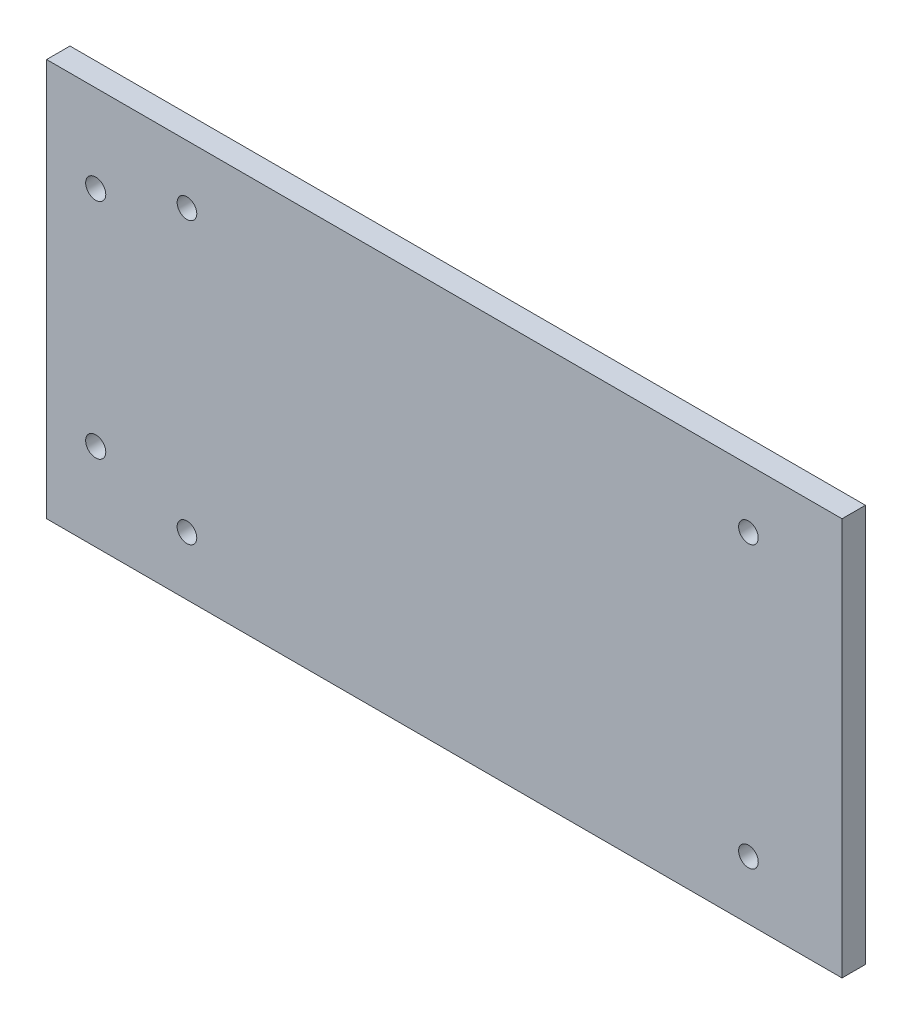
ISO-10303-21;
HEADER;
FILE_DESCRIPTION(('STEP AP214'),'2;1');
FILE_NAME('part.step','',(''),(''),'','','');
FILE_SCHEMA(('AUTOMOTIVE_DESIGN { 1 0 10303 214 1 1 1 1 }'));
ENDSEC;
DATA;
#1=APPLICATION_CONTEXT('core data for automotive mechanical design processes');
#2=APPLICATION_PROTOCOL_DEFINITION('international standard','automotive_design',2000,#1);
#3=PRODUCT_CONTEXT('',#1,'mechanical');
#4=PRODUCT('Part','Part','',(#3));
#5=PRODUCT_RELATED_PRODUCT_CATEGORY('part','',(#4));
#6=PRODUCT_DEFINITION_FORMATION('','',#4);
#7=PRODUCT_DEFINITION_CONTEXT('part definition',#1,'design');
#8=PRODUCT_DEFINITION('design','',#6,#7);
#9=PRODUCT_DEFINITION_SHAPE('','',#8);
#10=(LENGTH_UNIT() NAMED_UNIT(*) SI_UNIT(.MILLI.,.METRE.));
#11=(NAMED_UNIT(*) PLANE_ANGLE_UNIT() SI_UNIT($,.RADIAN.));
#12=(NAMED_UNIT(*) SI_UNIT($,.STERADIAN.) SOLID_ANGLE_UNIT());
#13=UNCERTAINTY_MEASURE_WITH_UNIT(LENGTH_MEASURE(1.E-05),#10,'distance_accuracy_value','');
#14=(GEOMETRIC_REPRESENTATION_CONTEXT(3) GLOBAL_UNCERTAINTY_ASSIGNED_CONTEXT((#13)) GLOBAL_UNIT_ASSIGNED_CONTEXT((#10,
#11,#12)) REPRESENTATION_CONTEXT('',''));
#15=CARTESIAN_POINT('',(0.,0.,0.));
#16=DIRECTION('',(0.,0.,1.));
#17=DIRECTION('',(1.,0.,0.));
#18=AXIS2_PLACEMENT_3D('',#15,#16,#17);
#19=CARTESIAN_POINT('',(0.,0.,5.));
#20=DIRECTION('',(0.,0.,-1.));
#21=DIRECTION('',(-1.,0.,0.));
#22=AXIS2_PLACEMENT_3D('',#19,#20,#21);
#23=PLANE('',#22);
#24=CARTESIAN_POINT('',(-74.5,23.85,5.));
#25=DIRECTION('',(0.,0.,1.));
#26=DIRECTION('',(1.,0.,0.));
#27=AXIS2_PLACEMENT_3D('',#24,#25,#26);
#28=CIRCLE('',#27,2.15);
#29=CARTESIAN_POINT('',(-72.35,23.85,5.));
#30=VERTEX_POINT('',#29);
#31=EDGE_CURVE('E126',#30,#30,#28,.T.);
#32=ORIENTED_EDGE('',*,*,#31,.F.);
#33=EDGE_LOOP('',(#32));
#34=FACE_BOUND('',#33,.T.);
#35=CARTESIAN_POINT('',(-74.5,-23.85,5.));
#36=DIRECTION('',(0.,0.,1.));
#37=DIRECTION('',(1.,0.,0.));
#38=AXIS2_PLACEMENT_3D('',#35,#36,#37);
#39=CIRCLE('',#38,2.15);
#40=CARTESIAN_POINT('',(-72.35,-23.85,5.));
#41=VERTEX_POINT('',#40);
#42=EDGE_CURVE('E117',#41,#41,#39,.T.);
#43=ORIENTED_EDGE('',*,*,#42,.F.);
#44=EDGE_LOOP('',(#43));
#45=FACE_BOUND('',#44,.T.);
#46=DIRECTION('',(-1.,0.,0.));
#47=VECTOR('',#46,1.);
#48=CARTESIAN_POINT('',(85.,42.5,5.));
#49=LINE('',#48,#47);
#50=CARTESIAN_POINT('',(85.,42.5,5.));
#51=VERTEX_POINT('',#50);
#52=CARTESIAN_POINT('',(-85.,42.5,5.));
#53=VERTEX_POINT('',#52);
#54=EDGE_CURVE('E91',#51,#53,#49,.T.);
#55=ORIENTED_EDGE('',*,*,#54,.T.);
#56=DIRECTION('',(0.,-1.,0.));
#57=VECTOR('',#56,1.);
#58=CARTESIAN_POINT('',(-85.,-42.5,5.));
#59=LINE('',#58,#57);
#60=CARTESIAN_POINT('',(-85.,-42.5,5.));
#61=VERTEX_POINT('',#60);
#62=EDGE_CURVE('E86',#53,#61,#59,.T.);
#63=ORIENTED_EDGE('',*,*,#62,.T.);
#64=DIRECTION('',(1.,0.,0.));
#65=VECTOR('',#64,1.);
#66=CARTESIAN_POINT('',(85.,-42.5,5.));
#67=LINE('',#66,#65);
#68=CARTESIAN_POINT('',(85.,-42.5,5.));
#69=VERTEX_POINT('',#68);
#70=EDGE_CURVE('E93',#61,#69,#67,.T.);
#71=ORIENTED_EDGE('',*,*,#70,.T.);
#72=DIRECTION('',(0.,1.,0.));
#73=VECTOR('',#72,1.);
#74=CARTESIAN_POINT('',(85.,-42.5,5.));
#75=LINE('',#74,#73);
#76=EDGE_CURVE('E59',#69,#51,#75,.T.);
#77=ORIENTED_EDGE('',*,*,#76,.T.);
#78=EDGE_LOOP('',(#55,#63,#71,#77));
#79=FACE_BOUND('',#78,.T.);
#80=CARTESIAN_POINT('',(-55.,-30.,5.));
#81=DIRECTION('',(0.,0.,1.));
#82=DIRECTION('',(1.,0.,0.));
#83=AXIS2_PLACEMENT_3D('',#80,#81,#82);
#84=CIRCLE('',#83,2.1);
#85=CARTESIAN_POINT('',(-52.9,-30.,5.));
#86=VERTEX_POINT('',#85);
#87=EDGE_CURVE('E108',#86,#86,#84,.T.);
#88=ORIENTED_EDGE('',*,*,#87,.F.);
#89=EDGE_LOOP('',(#88));
#90=FACE_BOUND('',#89,.T.);
#91=CARTESIAN_POINT('',(65.,-30.,5.));
#92=DIRECTION('',(0.,0.,1.));
#93=DIRECTION('',(1.,0.,0.));
#94=AXIS2_PLACEMENT_3D('',#91,#92,#93);
#95=CIRCLE('',#94,2.1);
#96=CARTESIAN_POINT('',(67.1,-30.,5.));
#97=VERTEX_POINT('',#96);
#98=EDGE_CURVE('E139',#97,#97,#95,.T.);
#99=ORIENTED_EDGE('',*,*,#98,.F.);
#100=EDGE_LOOP('',(#99));
#101=FACE_BOUND('',#100,.T.);
#102=CARTESIAN_POINT('',(65.,30.,5.));
#103=DIRECTION('',(0.,0.,1.));
#104=DIRECTION('',(-1.,0.,0.));
#105=AXIS2_PLACEMENT_3D('',#102,#103,#104);
#106=CIRCLE('',#105,2.10000000000001);
#107=CARTESIAN_POINT('',(62.9,30.,5.));
#108=VERTEX_POINT('',#107);
#109=EDGE_CURVE('E133',#108,#108,#106,.T.);
#110=ORIENTED_EDGE('',*,*,#109,.F.);
#111=EDGE_LOOP('',(#110));
#112=FACE_BOUND('',#111,.T.);
#113=CARTESIAN_POINT('',(-55.,30.,5.));
#114=DIRECTION('',(0.,0.,1.));
#115=DIRECTION('',(-1.,0.,0.));
#116=AXIS2_PLACEMENT_3D('',#113,#114,#115);
#117=CIRCLE('',#116,2.10000000000001);
#118=CARTESIAN_POINT('',(-57.1,30.,5.));
#119=VERTEX_POINT('',#118);
#120=EDGE_CURVE('E121',#119,#119,#117,.T.);
#121=ORIENTED_EDGE('',*,*,#120,.F.);
#122=EDGE_LOOP('',(#121));
#123=FACE_BOUND('',#122,.T.);
#124=ADVANCED_FACE('F39',(#34,#45,#79,#90,#101,#112,#123),#23,.F.);
#125=CARTESIAN_POINT('',(0.,0.,0.));
#126=DIRECTION('',(0.,0.,-1.));
#127=DIRECTION('',(-1.,0.,0.));
#128=AXIS2_PLACEMENT_3D('',#125,#126,#127);
#129=PLANE('',#128);
#130=CARTESIAN_POINT('',(-74.5,23.85,0.));
#131=DIRECTION('',(0.,0.,-1.));
#132=DIRECTION('',(-1.,0.,0.));
#133=AXIS2_PLACEMENT_3D('',#130,#131,#132);
#134=CIRCLE('',#133,2.15);
#135=CARTESIAN_POINT('',(-76.65,23.85,0.));
#136=VERTEX_POINT('',#135);
#137=EDGE_CURVE('E43',#136,#136,#134,.T.);
#138=ORIENTED_EDGE('',*,*,#137,.F.);
#139=EDGE_LOOP('',(#138));
#140=FACE_BOUND('',#139,.T.);
#141=CARTESIAN_POINT('',(-74.5,-23.85,0.));
#142=DIRECTION('',(0.,0.,-1.));
#143=DIRECTION('',(-1.,0.,0.));
#144=AXIS2_PLACEMENT_3D('',#141,#142,#143);
#145=CIRCLE('',#144,2.15);
#146=CARTESIAN_POINT('',(-76.65,-23.85,0.));
#147=VERTEX_POINT('',#146);
#148=EDGE_CURVE('E111',#147,#147,#145,.T.);
#149=ORIENTED_EDGE('',*,*,#148,.F.);
#150=EDGE_LOOP('',(#149));
#151=FACE_BOUND('',#150,.T.);
#152=CARTESIAN_POINT('',(65.,30.,0.));
#153=DIRECTION('',(0.,0.,1.));
#154=DIRECTION('',(-1.,0.,0.));
#155=AXIS2_PLACEMENT_3D('',#152,#153,#154);
#156=CIRCLE('',#155,2.10000000000001);
#157=CARTESIAN_POINT('',(62.9,30.,0.));
#158=VERTEX_POINT('',#157);
#159=EDGE_CURVE('E132',#158,#158,#156,.T.);
#160=ORIENTED_EDGE('',*,*,#159,.T.);
#161=EDGE_LOOP('',(#160));
#162=FACE_BOUND('',#161,.T.);
#163=CARTESIAN_POINT('',(-55.,-30.,0.));
#164=DIRECTION('',(0.,0.,1.));
#165=DIRECTION('',(1.,0.,0.));
#166=AXIS2_PLACEMENT_3D('',#163,#164,#165);
#167=CIRCLE('',#166,2.1);
#168=CARTESIAN_POINT('',(-52.9,-30.,0.));
#169=VERTEX_POINT('',#168);
#170=EDGE_CURVE('E141',#169,#169,#167,.T.);
#171=ORIENTED_EDGE('',*,*,#170,.T.);
#172=EDGE_LOOP('',(#171));
#173=FACE_BOUND('',#172,.T.);
#174=DIRECTION('',(-1.,0.,0.));
#175=VECTOR('',#174,1.);
#176=CARTESIAN_POINT('',(85.,42.5,0.));
#177=LINE('',#176,#175);
#178=CARTESIAN_POINT('',(85.,42.5,0.));
#179=VERTEX_POINT('',#178);
#180=CARTESIAN_POINT('',(-85.,42.5,0.));
#181=VERTEX_POINT('',#180);
#182=EDGE_CURVE('E106',#179,#181,#177,.T.);
#183=ORIENTED_EDGE('',*,*,#182,.F.);
#184=DIRECTION('',(0.,1.,0.));
#185=VECTOR('',#184,1.);
#186=CARTESIAN_POINT('',(85.,-42.5,0.));
#187=LINE('',#186,#185);
#188=CARTESIAN_POINT('',(85.,-42.5,0.));
#189=VERTEX_POINT('',#188);
#190=EDGE_CURVE('E81',#189,#179,#187,.T.);
#191=ORIENTED_EDGE('',*,*,#190,.F.);
#192=DIRECTION('',(1.,0.,0.));
#193=VECTOR('',#192,1.);
#194=CARTESIAN_POINT('',(85.,-42.5,0.));
#195=LINE('',#194,#193);
#196=CARTESIAN_POINT('',(-85.,-42.5,0.));
#197=VERTEX_POINT('',#196);
#198=EDGE_CURVE('E73',#197,#189,#195,.T.);
#199=ORIENTED_EDGE('',*,*,#198,.F.);
#200=DIRECTION('',(0.,-1.,0.));
#201=VECTOR('',#200,1.);
#202=CARTESIAN_POINT('',(-85.,-42.5,0.));
#203=LINE('',#202,#201);
#204=EDGE_CURVE('E100',#181,#197,#203,.T.);
#205=ORIENTED_EDGE('',*,*,#204,.F.);
#206=EDGE_LOOP('',(#183,#191,#199,#205));
#207=FACE_BOUND('',#206,.T.);
#208=CARTESIAN_POINT('',(65.,-30.,0.));
#209=DIRECTION('',(0.,0.,1.));
#210=DIRECTION('',(1.,0.,0.));
#211=AXIS2_PLACEMENT_3D('',#208,#209,#210);
#212=CIRCLE('',#211,2.1);
#213=CARTESIAN_POINT('',(67.1,-30.,0.));
#214=VERTEX_POINT('',#213);
#215=EDGE_CURVE('E140',#214,#214,#212,.T.);
#216=ORIENTED_EDGE('',*,*,#215,.T.);
#217=EDGE_LOOP('',(#216));
#218=FACE_BOUND('',#217,.T.);
#219=CARTESIAN_POINT('',(-55.,30.,0.));
#220=DIRECTION('',(0.,0.,1.));
#221=DIRECTION('',(-1.,0.,0.));
#222=AXIS2_PLACEMENT_3D('',#219,#220,#221);
#223=CIRCLE('',#222,2.10000000000001);
#224=CARTESIAN_POINT('',(-57.1,30.,0.));
#225=VERTEX_POINT('',#224);
#226=EDGE_CURVE('E116',#225,#225,#223,.T.);
#227=ORIENTED_EDGE('',*,*,#226,.T.);
#228=EDGE_LOOP('',(#227));
#229=FACE_BOUND('',#228,.T.);
#230=ADVANCED_FACE('F151',(#140,#151,#162,#173,#207,#218,#229),#129,.T.);
#231=CARTESIAN_POINT('',(85.,42.5,5.));
#232=DIRECTION('',(0.,-1.,0.));
#233=DIRECTION('',(0.,0.,-1.));
#234=AXIS2_PLACEMENT_3D('',#231,#232,#233);
#235=PLANE('',#234);
#236=ORIENTED_EDGE('',*,*,#182,.T.);
#237=DIRECTION('',(0.,0.,-1.));
#238=VECTOR('',#237,1.);
#239=CARTESIAN_POINT('',(-85.,42.5,5.));
#240=LINE('',#239,#238);
#241=EDGE_CURVE('E11',#53,#181,#240,.T.);
#242=ORIENTED_EDGE('',*,*,#241,.F.);
#243=ORIENTED_EDGE('',*,*,#54,.F.);
#244=DIRECTION('',(0.,0.,-1.));
#245=VECTOR('',#244,1.);
#246=CARTESIAN_POINT('',(85.,42.5,5.));
#247=LINE('',#246,#245);
#248=EDGE_CURVE('E105',#51,#179,#247,.T.);
#249=ORIENTED_EDGE('',*,*,#248,.T.);
#250=EDGE_LOOP('',(#236,#242,#243,#249));
#251=FACE_BOUND('',#250,.T.);
#252=ADVANCED_FACE('F41',(#251),#235,.F.);
#253=CARTESIAN_POINT('',(-85.,-42.5,5.));
#254=DIRECTION('',(1.,0.,0.));
#255=DIRECTION('',(0.,0.,-1.));
#256=AXIS2_PLACEMENT_3D('',#253,#254,#255);
#257=PLANE('',#256);
#258=ORIENTED_EDGE('',*,*,#204,.T.);
#259=DIRECTION('',(0.,0.,-1.));
#260=VECTOR('',#259,1.);
#261=CARTESIAN_POINT('',(-85.,-42.5,5.));
#262=LINE('',#261,#260);
#263=EDGE_CURVE('E47',#61,#197,#262,.T.);
#264=ORIENTED_EDGE('',*,*,#263,.F.);
#265=ORIENTED_EDGE('',*,*,#62,.F.);
#266=ORIENTED_EDGE('',*,*,#241,.T.);
#267=EDGE_LOOP('',(#258,#264,#265,#266));
#268=FACE_BOUND('',#267,.T.);
#269=ADVANCED_FACE('F96',(#268),#257,.F.);
#270=CARTESIAN_POINT('',(85.,-42.5,5.));
#271=DIRECTION('',(0.,1.,0.));
#272=DIRECTION('',(0.,0.,1.));
#273=AXIS2_PLACEMENT_3D('',#270,#271,#272);
#274=PLANE('',#273);
#275=ORIENTED_EDGE('',*,*,#198,.T.);
#276=DIRECTION('',(0.,0.,-1.));
#277=VECTOR('',#276,1.);
#278=CARTESIAN_POINT('',(85.,-42.5,5.));
#279=LINE('',#278,#277);
#280=EDGE_CURVE('E98',#69,#189,#279,.T.);
#281=ORIENTED_EDGE('',*,*,#280,.F.);
#282=ORIENTED_EDGE('',*,*,#70,.F.);
#283=ORIENTED_EDGE('',*,*,#263,.T.);
#284=EDGE_LOOP('',(#275,#281,#282,#283));
#285=FACE_BOUND('',#284,.T.);
#286=ADVANCED_FACE('F99',(#285),#274,.F.);
#287=CARTESIAN_POINT('',(85.,-42.5,5.));
#288=DIRECTION('',(-1.,0.,0.));
#289=DIRECTION('',(0.,0.,1.));
#290=AXIS2_PLACEMENT_3D('',#287,#288,#289);
#291=PLANE('',#290);
#292=ORIENTED_EDGE('',*,*,#190,.T.);
#293=ORIENTED_EDGE('',*,*,#248,.F.);
#294=ORIENTED_EDGE('',*,*,#76,.F.);
#295=ORIENTED_EDGE('',*,*,#280,.T.);
#296=EDGE_LOOP('',(#292,#293,#294,#295));
#297=FACE_BOUND('',#296,.T.);
#298=ADVANCED_FACE('F160',(#297),#291,.F.);
#299=CARTESIAN_POINT('',(-55.,-30.,5.));
#300=DIRECTION('',(0.,0.,-1.));
#301=DIRECTION('',(-1.,0.,0.));
#302=AXIS2_PLACEMENT_3D('',#299,#300,#301);
#303=CYLINDRICAL_SURFACE('',#302,2.1);
#304=ORIENTED_EDGE('',*,*,#87,.T.);
#305=EDGE_LOOP('',(#304));
#306=FACE_BOUND('',#305,.T.);
#307=ORIENTED_EDGE('',*,*,#170,.F.);
#308=EDGE_LOOP('',(#307));
#309=FACE_BOUND('',#308,.T.);
#310=ADVANCED_FACE('F152',(#306,#309),#303,.F.);
#311=CARTESIAN_POINT('',(65.,-30.,5.));
#312=DIRECTION('',(0.,0.,-1.));
#313=DIRECTION('',(-1.,0.,0.));
#314=AXIS2_PLACEMENT_3D('',#311,#312,#313);
#315=CYLINDRICAL_SURFACE('',#314,2.1);
#316=ORIENTED_EDGE('',*,*,#98,.T.);
#317=EDGE_LOOP('',(#316));
#318=FACE_BOUND('',#317,.T.);
#319=ORIENTED_EDGE('',*,*,#215,.F.);
#320=EDGE_LOOP('',(#319));
#321=FACE_BOUND('',#320,.T.);
#322=ADVANCED_FACE('F156',(#318,#321),#315,.F.);
#323=CARTESIAN_POINT('',(65.,30.,5.));
#324=DIRECTION('',(0.,0.,-1.));
#325=DIRECTION('',(-1.,0.,0.));
#326=AXIS2_PLACEMENT_3D('',#323,#324,#325);
#327=CYLINDRICAL_SURFACE('',#326,2.10000000000001);
#328=ORIENTED_EDGE('',*,*,#109,.T.);
#329=EDGE_LOOP('',(#328));
#330=FACE_BOUND('',#329,.T.);
#331=ORIENTED_EDGE('',*,*,#159,.F.);
#332=EDGE_LOOP('',(#331));
#333=FACE_BOUND('',#332,.T.);
#334=ADVANCED_FACE('F163',(#330,#333),#327,.F.);
#335=CARTESIAN_POINT('',(-55.,30.,5.));
#336=DIRECTION('',(0.,0.,-1.));
#337=DIRECTION('',(-1.,0.,0.));
#338=AXIS2_PLACEMENT_3D('',#335,#336,#337);
#339=CYLINDRICAL_SURFACE('',#338,2.10000000000001);
#340=ORIENTED_EDGE('',*,*,#120,.T.);
#341=EDGE_LOOP('',(#340));
#342=FACE_BOUND('',#341,.T.);
#343=ORIENTED_EDGE('',*,*,#226,.F.);
#344=EDGE_LOOP('',(#343));
#345=FACE_BOUND('',#344,.T.);
#346=ADVANCED_FACE('F192',(#342,#345),#339,.F.);
#347=CARTESIAN_POINT('',(-74.5,-23.85,-5.));
#348=DIRECTION('',(0.,0.,1.));
#349=DIRECTION('',(1.,0.,0.));
#350=AXIS2_PLACEMENT_3D('',#347,#348,#349);
#351=CYLINDRICAL_SURFACE('',#350,2.15);
#352=ORIENTED_EDGE('',*,*,#148,.T.);
#353=EDGE_LOOP('',(#352));
#354=FACE_BOUND('',#353,.T.);
#355=ORIENTED_EDGE('',*,*,#42,.T.);
#356=EDGE_LOOP('',(#355));
#357=FACE_BOUND('',#356,.T.);
#358=ADVANCED_FACE('F198',(#354,#357),#351,.F.);
#359=CARTESIAN_POINT('',(-74.5,23.85,-5.));
#360=DIRECTION('',(0.,0.,1.));
#361=DIRECTION('',(1.,0.,0.));
#362=AXIS2_PLACEMENT_3D('',#359,#360,#361);
#363=CYLINDRICAL_SURFACE('',#362,2.15);
#364=ORIENTED_EDGE('',*,*,#137,.T.);
#365=EDGE_LOOP('',(#364));
#366=FACE_BOUND('',#365,.T.);
#367=ORIENTED_EDGE('',*,*,#31,.T.);
#368=EDGE_LOOP('',(#367));
#369=FACE_BOUND('',#368,.T.);
#370=ADVANCED_FACE('F205',(#366,#369),#363,.F.);
#371=CLOSED_SHELL('',(#124,#230,#252,#269,#286,#298,#310,#322,#334,#346,#358,#370));
#372=MANIFOLD_SOLID_BREP('B2',#371);
#373=ADVANCED_BREP_SHAPE_REPRESENTATION('',(#18,#372),#14);
#374=SHAPE_DEFINITION_REPRESENTATION(#9,#373);
ENDSEC;
END-ISO-10303-21;
